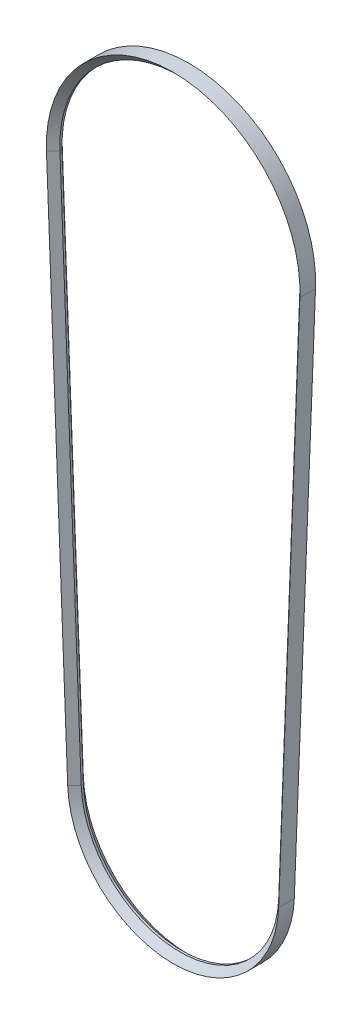
ISO-10303-21;
HEADER;
FILE_DESCRIPTION(('STEP AP214'),'2;1');
FILE_NAME('part.step','',(''),(''),'','','');
FILE_SCHEMA(('AUTOMOTIVE_DESIGN { 1 0 10303 214 1 1 1 1 }'));
ENDSEC;
DATA;
#1=APPLICATION_CONTEXT('core data for automotive mechanical design processes');
#2=APPLICATION_PROTOCOL_DEFINITION('international standard','automotive_design',2000,#1);
#3=PRODUCT_CONTEXT('',#1,'mechanical');
#4=PRODUCT('Part','Part','',(#3));
#5=PRODUCT_RELATED_PRODUCT_CATEGORY('part','',(#4));
#6=PRODUCT_DEFINITION_FORMATION('','',#4);
#7=PRODUCT_DEFINITION_CONTEXT('part definition',#1,'design');
#8=PRODUCT_DEFINITION('design','',#6,#7);
#9=PRODUCT_DEFINITION_SHAPE('','',#8);
#10=(LENGTH_UNIT() NAMED_UNIT(*) SI_UNIT(.MILLI.,.METRE.));
#11=(NAMED_UNIT(*) PLANE_ANGLE_UNIT() SI_UNIT($,.RADIAN.));
#12=(NAMED_UNIT(*) SI_UNIT($,.STERADIAN.) SOLID_ANGLE_UNIT());
#13=UNCERTAINTY_MEASURE_WITH_UNIT(LENGTH_MEASURE(1.E-05),#10,'distance_accuracy_value','');
#14=(GEOMETRIC_REPRESENTATION_CONTEXT(3) GLOBAL_UNCERTAINTY_ASSIGNED_CONTEXT((#13)) GLOBAL_UNIT_ASSIGNED_CONTEXT((#10,
#11,#12)) REPRESENTATION_CONTEXT('',''));
#15=CARTESIAN_POINT('',(0.,0.,0.));
#16=DIRECTION('',(0.,0.,1.));
#17=DIRECTION('',(1.,0.,0.));
#18=AXIS2_PLACEMENT_3D('',#15,#16,#17);
#19=CARTESIAN_POINT('',(2.78515976523799E-13,635.,9.20625000000001));
#20=DIRECTION('',(0.,0.,1.));
#21=DIRECTION('',(1.,0.,0.));
#22=AXIS2_PLACEMENT_3D('',#19,#20,#21);
#23=CONICAL_SURFACE('',#22,149.20625,0.785398163397449);
#24=DIRECTION('',(0.706558559816522,0.0278388496530093,-0.707106781186547));
#25=VECTOR('',#24,1.);
#26=CARTESIAN_POINT('',(-141.15922404193,629.438238188977,1.26875000000001));
#27=LINE('',#26,#25);
#28=CARTESIAN_POINT('',(-149.090570081538,629.125738188977,9.20625000000001));
#29=VERTEX_POINT('',#28);
#30=CARTESIAN_POINT('',(-141.15922404193,629.438238188977,1.26875000000001));
#31=VERTEX_POINT('',#30);
#32=EDGE_CURVE('E140',#29,#31,#27,.T.);
#33=ORIENTED_EDGE('',*,*,#32,.T.);
#34=CARTESIAN_POINT('',(2.78515976523799E-13,635.,1.26875000000001));
#35=DIRECTION('',(0.,0.,-1.));
#36=DIRECTION('',(-1.,0.,0.));
#37=AXIS2_PLACEMENT_3D('',#34,#35,#36);
#38=CIRCLE('',#37,141.26875);
#39=CARTESIAN_POINT('',(141.159224041931,629.438238188977,1.26875000000001));
#40=VERTEX_POINT('',#39);
#41=EDGE_CURVE('E45',#31,#40,#38,.T.);
#42=ORIENTED_EDGE('',*,*,#41,.T.);
#43=CARTESIAN_POINT('',(149.090570081539,629.125738188977,9.20624999999987));
#44=DIRECTION('',(-0.706558559816521,0.0278388496530284,-0.707106781186547));
#45=VECTOR('',#44,1.);
#46=LINE('',#43,#45);
#47=CARTESIAN_POINT('',(149.090570081538,629.125738188975,9.20625000000001));
#48=VERTEX_POINT('',#47);
#49=EDGE_CURVE('E104',#48,#40,#46,.T.);
#50=ORIENTED_EDGE('',*,*,#49,.F.);
#51=CARTESIAN_POINT('',(2.78515976523799E-13,635.,9.20625000000001));
#52=DIRECTION('',(0.,0.,-1.));
#53=DIRECTION('',(-1.,0.,0.));
#54=AXIS2_PLACEMENT_3D('',#51,#52,#53);
#55=CIRCLE('',#54,149.20625);
#56=EDGE_CURVE('E11',#29,#48,#55,.T.);
#57=ORIENTED_EDGE('',*,*,#56,.F.);
#58=EDGE_LOOP('',(#33,#42,#50,#57));
#59=FACE_BOUND('',#58,.T.);
#60=ADVANCED_FACE('F34',(#59),#23,.F.);
#61=CARTESIAN_POINT('',(2.78515976523799E-13,635.,0.));
#62=DIRECTION('',(0.,0.,-1.));
#63=DIRECTION('',(-1.,0.,0.));
#64=AXIS2_PLACEMENT_3D('',#61,#62,#63);
#65=CYLINDRICAL_SURFACE('',#64,141.26875);
#66=DIRECTION('',(0.,0.,-1.));
#67=VECTOR('',#66,1.);
#68=CARTESIAN_POINT('',(-141.15922404193,629.438238188977,1.26875000000001));
#69=LINE('',#68,#67);
#70=CARTESIAN_POINT('',(-141.15922404193,629.438238188977,-1.26875000000001));
#71=VERTEX_POINT('',#70);
#72=EDGE_CURVE('E390',#31,#71,#69,.T.);
#73=ORIENTED_EDGE('',*,*,#72,.T.);
#74=CARTESIAN_POINT('',(2.78515976523799E-13,635.,-1.26875000000001));
#75=DIRECTION('',(0.,0.,-1.));
#76=DIRECTION('',(-1.,0.,0.));
#77=AXIS2_PLACEMENT_3D('',#74,#75,#76);
#78=CIRCLE('',#77,141.26875);
#79=CARTESIAN_POINT('',(141.159224041931,629.438238188977,-1.26875000000001));
#80=VERTEX_POINT('',#79);
#81=EDGE_CURVE('E135',#71,#80,#78,.T.);
#82=ORIENTED_EDGE('',*,*,#81,.T.);
#83=CARTESIAN_POINT('',(141.159224041931,629.438238188977,1.26875000000001));
#84=DIRECTION('',(0.,0.,-1.));
#85=VECTOR('',#84,1.);
#86=LINE('',#83,#85);
#87=EDGE_CURVE('E116',#40,#80,#86,.T.);
#88=ORIENTED_EDGE('',*,*,#87,.F.);
#89=ORIENTED_EDGE('',*,*,#41,.F.);
#90=EDGE_LOOP('',(#73,#82,#88,#89));
#91=FACE_BOUND('',#90,.T.);
#92=ADVANCED_FACE('F133',(#91),#65,.F.);
#93=CARTESIAN_POINT('',(2.78515976523799E-13,635.,-1.26875000000001));
#94=DIRECTION('',(0.,0.,-1.));
#95=DIRECTION('',(-1.,0.,0.));
#96=AXIS2_PLACEMENT_3D('',#93,#94,#95);
#97=CONICAL_SURFACE('',#96,141.26875,0.785398163397449);
#98=DIRECTION('',(-0.706558559816522,-0.0278388496530093,-0.707106781186547));
#99=VECTOR('',#98,1.);
#100=CARTESIAN_POINT('',(-149.090570081538,629.125738188977,-9.20625));
#101=LINE('',#100,#99);
#102=CARTESIAN_POINT('',(-149.090570081538,629.125738188977,-9.20625));
#103=VERTEX_POINT('',#102);
#104=EDGE_CURVE('E387',#71,#103,#101,.T.);
#105=ORIENTED_EDGE('',*,*,#104,.T.);
#106=CARTESIAN_POINT('',(2.78515976523799E-13,635.,-9.20625));
#107=DIRECTION('',(0.,0.,-1.));
#108=DIRECTION('',(-1.,0.,0.));
#109=AXIS2_PLACEMENT_3D('',#106,#107,#108);
#110=CIRCLE('',#109,149.20625);
#111=CARTESIAN_POINT('',(149.090570081538,629.125738188975,-9.20625));
#112=VERTEX_POINT('',#111);
#113=EDGE_CURVE('E115',#103,#112,#110,.T.);
#114=ORIENTED_EDGE('',*,*,#113,.T.);
#115=CARTESIAN_POINT('',(141.159224041931,629.438238188977,-1.26875000000001));
#116=DIRECTION('',(0.706558559816522,-0.0278388496530185,-0.707106781186547));
#117=VECTOR('',#116,1.);
#118=LINE('',#115,#117);
#119=EDGE_CURVE('E136',#80,#112,#118,.T.);
#120=ORIENTED_EDGE('',*,*,#119,.F.);
#121=ORIENTED_EDGE('',*,*,#81,.F.);
#122=EDGE_LOOP('',(#105,#114,#120,#121));
#123=FACE_BOUND('',#122,.T.);
#124=ADVANCED_FACE('F174',(#123),#97,.F.);
#125=CARTESIAN_POINT('',(2.78515976523799E-13,635.,0.));
#126=DIRECTION('',(0.,0.,-1.));
#127=DIRECTION('',(-1.,0.,0.));
#128=AXIS2_PLACEMENT_3D('',#125,#126,#127);
#129=CYLINDRICAL_SURFACE('',#128,149.20625);
#130=DIRECTION('',(0.,0.,1.));
#131=VECTOR('',#130,1.);
#132=CARTESIAN_POINT('',(-149.090570081538,629.125738188977,9.20625000000001));
#133=LINE('',#132,#131);
#134=EDGE_CURVE('E384',#103,#29,#133,.T.);
#135=ORIENTED_EDGE('',*,*,#134,.T.);
#136=ORIENTED_EDGE('',*,*,#56,.T.);
#137=CARTESIAN_POINT('',(149.090570081539,629.125738188977,-9.20625));
#138=DIRECTION('',(0.,0.,1.));
#139=VECTOR('',#138,1.);
#140=LINE('',#137,#139);
#141=EDGE_CURVE('E53',#112,#48,#140,.T.);
#142=ORIENTED_EDGE('',*,*,#141,.F.);
#143=ORIENTED_EDGE('',*,*,#113,.F.);
#144=EDGE_LOOP('',(#135,#136,#142,#143));
#145=FACE_BOUND('',#144,.T.);
#146=ADVANCED_FACE('F163',(#145),#129,.T.);
#147=CARTESIAN_POINT('',(-116.178606594347,-4.57750984251966,1.26875000000001));
#148=DIRECTION('',(0.706558559816521,0.0278388496530131,0.707106781186548));
#149=DIRECTION('',(0.707380944980586,0.,-0.706832511050795));
#150=AXIS2_PLACEMENT_3D('',#147,#148,#149);
#151=PLANE('',#150);
#152=DIRECTION('',(0.706558559816522,0.0278388496530093,-0.707106781186547));
#153=VECTOR('',#152,1.);
#154=CARTESIAN_POINT('',(-116.178606594347,-4.57750984251966,1.26875000000001));
#155=LINE('',#154,#153);
#156=CARTESIAN_POINT('',(-124.109952633955,-4.89000984251961,9.20625000000001));
#157=VERTEX_POINT('',#156);
#158=CARTESIAN_POINT('',(-116.178606594347,-4.57750984251966,1.26875000000001));
#159=VERTEX_POINT('',#158);
#160=EDGE_CURVE('E370',#157,#159,#155,.T.);
#161=ORIENTED_EDGE('',*,*,#160,.T.);
#162=DIRECTION('',(-0.0393700787401567,0.999224697903326,0.));
#163=VECTOR('',#162,1.);
#164=CARTESIAN_POINT('',(-116.178606594347,-4.57750984251966,1.26875000000001));
#165=LINE('',#164,#163);
#166=EDGE_CURVE('E399',#159,#31,#165,.T.);
#167=ORIENTED_EDGE('',*,*,#166,.T.);
#168=ORIENTED_EDGE('',*,*,#32,.F.);
#169=DIRECTION('',(-0.0393700787401567,0.999224697903326,0.));
#170=VECTOR('',#169,1.);
#171=CARTESIAN_POINT('',(-124.109952633955,-4.89000984251961,9.20625000000001));
#172=LINE('',#171,#170);
#173=EDGE_CURVE('E401',#157,#29,#172,.T.);
#174=ORIENTED_EDGE('',*,*,#173,.F.);
#175=EDGE_LOOP('',(#161,#167,#168,#174));
#176=FACE_BOUND('',#175,.T.);
#177=ADVANCED_FACE('F173',(#176),#151,.T.);
#178=CARTESIAN_POINT('',(-116.178606594347,-4.57750984251966,1.26875000000001));
#179=DIRECTION('',(0.999224697903326,0.0393700787401567,0.));
#180=DIRECTION('',(-0.0393700787401567,0.999224697903326,0.));
#181=AXIS2_PLACEMENT_3D('',#178,#179,#180);
#182=PLANE('',#181);
#183=DIRECTION('',(0.,0.,-1.));
#184=VECTOR('',#183,1.);
#185=CARTESIAN_POINT('',(-116.178606594347,-4.57750984251966,1.26875000000001));
#186=LINE('',#185,#184);
#187=CARTESIAN_POINT('',(-116.178606594347,-4.57750984251966,-1.26875000000001));
#188=VERTEX_POINT('',#187);
#189=EDGE_CURVE('E368',#159,#188,#186,.T.);
#190=ORIENTED_EDGE('',*,*,#189,.T.);
#191=DIRECTION('',(-0.0393700787401567,0.999224697903326,0.));
#192=VECTOR('',#191,1.);
#193=CARTESIAN_POINT('',(-116.178606594347,-4.57750984251966,-1.26875000000001));
#194=LINE('',#193,#192);
#195=EDGE_CURVE('E396',#188,#71,#194,.T.);
#196=ORIENTED_EDGE('',*,*,#195,.T.);
#197=ORIENTED_EDGE('',*,*,#72,.F.);
#198=ORIENTED_EDGE('',*,*,#166,.F.);
#199=EDGE_LOOP('',(#190,#196,#197,#198));
#200=FACE_BOUND('',#199,.T.);
#201=ADVANCED_FACE('F235',(#200),#182,.T.);
#202=CARTESIAN_POINT('',(-124.109952633955,-4.89000984251961,-9.20625));
#203=DIRECTION('',(0.706558559816521,0.0278388496530131,-0.707106781186548));
#204=DIRECTION('',(-0.707380944980586,0.,-0.706832511050795));
#205=AXIS2_PLACEMENT_3D('',#202,#203,#204);
#206=PLANE('',#205);
#207=DIRECTION('',(-0.706558559816522,-0.0278388496530093,-0.707106781186547));
#208=VECTOR('',#207,1.);
#209=CARTESIAN_POINT('',(-124.109952633955,-4.89000984251961,-9.20625));
#210=LINE('',#209,#208);
#211=CARTESIAN_POINT('',(-124.109952633955,-4.89000984251961,-9.20625));
#212=VERTEX_POINT('',#211);
#213=EDGE_CURVE('E365',#188,#212,#210,.T.);
#214=ORIENTED_EDGE('',*,*,#213,.T.);
#215=DIRECTION('',(-0.0393700787401567,0.999224697903326,0.));
#216=VECTOR('',#215,1.);
#217=CARTESIAN_POINT('',(-124.109952633955,-4.89000984251961,-9.20625));
#218=LINE('',#217,#216);
#219=EDGE_CURVE('E393',#212,#103,#218,.T.);
#220=ORIENTED_EDGE('',*,*,#219,.T.);
#221=ORIENTED_EDGE('',*,*,#104,.F.);
#222=ORIENTED_EDGE('',*,*,#195,.F.);
#223=EDGE_LOOP('',(#214,#220,#221,#222));
#224=FACE_BOUND('',#223,.T.);
#225=ADVANCED_FACE('F232',(#224),#206,.T.);
#226=CARTESIAN_POINT('',(-124.109952633955,-4.89000984251961,9.20625000000001));
#227=DIRECTION('',(-0.999224697903326,-0.0393700787401567,0.));
#228=DIRECTION('',(0.0393700787401567,-0.999224697903326,0.));
#229=AXIS2_PLACEMENT_3D('',#226,#227,#228);
#230=PLANE('',#229);
#231=DIRECTION('',(0.,0.,1.));
#232=VECTOR('',#231,1.);
#233=CARTESIAN_POINT('',(-124.109952633955,-4.89000984251961,9.20625000000001));
#234=LINE('',#233,#232);
#235=EDGE_CURVE('E193',#212,#157,#234,.T.);
#236=ORIENTED_EDGE('',*,*,#235,.T.);
#237=ORIENTED_EDGE('',*,*,#173,.T.);
#238=ORIENTED_EDGE('',*,*,#134,.F.);
#239=ORIENTED_EDGE('',*,*,#219,.F.);
#240=EDGE_LOOP('',(#236,#237,#238,#239));
#241=FACE_BOUND('',#240,.T.);
#242=ADVANCED_FACE('F228',(#241),#230,.T.);
#243=CARTESIAN_POINT('',(0.,0.,9.20625000000001));
#244=DIRECTION('',(0.,0.,1.));
#245=DIRECTION('',(1.,0.,0.));
#246=AXIS2_PLACEMENT_3D('',#243,#244,#245);
#247=CONICAL_SURFACE('',#246,124.20625,0.785398163397448);
#248=DIRECTION('',(-0.706558559816521,0.027838849653018,-0.707106781186547));
#249=VECTOR('',#248,1.);
#250=CARTESIAN_POINT('',(116.178606594347,-4.5775098425197,1.26875000000001));
#251=LINE('',#250,#249);
#252=CARTESIAN_POINT('',(124.109952633955,-4.89000984251975,9.20625000000001));
#253=VERTEX_POINT('',#252);
#254=CARTESIAN_POINT('',(116.178606594347,-4.5775098425197,1.26875000000001));
#255=VERTEX_POINT('',#254);
#256=EDGE_CURVE('E359',#253,#255,#251,.T.);
#257=ORIENTED_EDGE('',*,*,#256,.T.);
#258=CARTESIAN_POINT('',(0.,0.,1.26875000000001));
#259=DIRECTION('',(0.,0.,-1.));
#260=DIRECTION('',(-1.,0.,0.));
#261=AXIS2_PLACEMENT_3D('',#258,#259,#260);
#262=CIRCLE('',#261,116.26875);
#263=EDGE_CURVE('E378',#255,#159,#262,.T.);
#264=ORIENTED_EDGE('',*,*,#263,.T.);
#265=ORIENTED_EDGE('',*,*,#160,.F.);
#266=CARTESIAN_POINT('',(0.,0.,9.20625000000001));
#267=DIRECTION('',(0.,0.,-1.));
#268=DIRECTION('',(-1.,0.,0.));
#269=AXIS2_PLACEMENT_3D('',#266,#267,#268);
#270=CIRCLE('',#269,124.20625);
#271=EDGE_CURVE('E381',#253,#157,#270,.T.);
#272=ORIENTED_EDGE('',*,*,#271,.F.);
#273=EDGE_LOOP('',(#257,#264,#265,#272));
#274=FACE_BOUND('',#273,.T.);
#275=ADVANCED_FACE('F224',(#274),#247,.F.);
#276=CARTESIAN_POINT('',(0.,0.,0.));
#277=DIRECTION('',(0.,0.,-1.));
#278=DIRECTION('',(-1.,0.,0.));
#279=AXIS2_PLACEMENT_3D('',#276,#277,#278);
#280=CYLINDRICAL_SURFACE('',#279,116.26875);
#281=DIRECTION('',(0.,0.,-1.));
#282=VECTOR('',#281,1.);
#283=CARTESIAN_POINT('',(116.178606594347,-4.5775098425197,1.26875000000001));
#284=LINE('',#283,#282);
#285=CARTESIAN_POINT('',(116.178606594347,-4.5775098425197,-1.26875000000001));
#286=VERTEX_POINT('',#285);
#287=EDGE_CURVE('E126',#255,#286,#284,.T.);
#288=ORIENTED_EDGE('',*,*,#287,.T.);
#289=CARTESIAN_POINT('',(0.,0.,-1.26875000000001));
#290=DIRECTION('',(0.,0.,-1.));
#291=DIRECTION('',(-1.,0.,0.));
#292=AXIS2_PLACEMENT_3D('',#289,#290,#291);
#293=CIRCLE('',#292,116.26875);
#294=EDGE_CURVE('E375',#286,#188,#293,.T.);
#295=ORIENTED_EDGE('',*,*,#294,.T.);
#296=ORIENTED_EDGE('',*,*,#189,.F.);
#297=ORIENTED_EDGE('',*,*,#263,.F.);
#298=EDGE_LOOP('',(#288,#295,#296,#297));
#299=FACE_BOUND('',#298,.T.);
#300=ADVANCED_FACE('F220',(#299),#280,.F.);
#301=CARTESIAN_POINT('',(0.,0.,-1.26875000000001));
#302=DIRECTION('',(0.,0.,-1.));
#303=DIRECTION('',(-1.,0.,0.));
#304=AXIS2_PLACEMENT_3D('',#301,#302,#303);
#305=CONICAL_SURFACE('',#304,116.26875,0.785398163397449);
#306=DIRECTION('',(0.706558559816522,-0.027838849653018,-0.707106781186547));
#307=VECTOR('',#306,1.);
#308=CARTESIAN_POINT('',(124.109952633955,-4.89000984251975,-9.20625));
#309=LINE('',#308,#307);
#310=CARTESIAN_POINT('',(124.109952633955,-4.89000984251975,-9.20625));
#311=VERTEX_POINT('',#310);
#312=EDGE_CURVE('E355',#286,#311,#309,.T.);
#313=ORIENTED_EDGE('',*,*,#312,.T.);
#314=CARTESIAN_POINT('',(0.,0.,-9.20625));
#315=DIRECTION('',(0.,0.,-1.));
#316=DIRECTION('',(-1.,0.,0.));
#317=AXIS2_PLACEMENT_3D('',#314,#315,#316);
#318=CIRCLE('',#317,124.20625);
#319=EDGE_CURVE('E373',#311,#212,#318,.T.);
#320=ORIENTED_EDGE('',*,*,#319,.T.);
#321=ORIENTED_EDGE('',*,*,#213,.F.);
#322=ORIENTED_EDGE('',*,*,#294,.F.);
#323=EDGE_LOOP('',(#313,#320,#321,#322));
#324=FACE_BOUND('',#323,.T.);
#325=ADVANCED_FACE('F216',(#324),#305,.F.);
#326=CARTESIAN_POINT('',(0.,0.,0.));
#327=DIRECTION('',(0.,0.,-1.));
#328=DIRECTION('',(-1.,0.,0.));
#329=AXIS2_PLACEMENT_3D('',#326,#327,#328);
#330=CYLINDRICAL_SURFACE('',#329,124.20625);
#331=DIRECTION('',(0.,0.,1.));
#332=VECTOR('',#331,1.);
#333=CARTESIAN_POINT('',(124.109952633955,-4.89000984251975,9.20625000000001));
#334=LINE('',#333,#332);
#335=EDGE_CURVE('E354',#311,#253,#334,.T.);
#336=ORIENTED_EDGE('',*,*,#335,.T.);
#337=ORIENTED_EDGE('',*,*,#271,.T.);
#338=ORIENTED_EDGE('',*,*,#235,.F.);
#339=ORIENTED_EDGE('',*,*,#319,.F.);
#340=EDGE_LOOP('',(#336,#337,#338,#339));
#341=FACE_BOUND('',#340,.T.);
#342=ADVANCED_FACE('F211',(#341),#330,.T.);
#343=CARTESIAN_POINT('',(124.109952633955,-4.89000984251975,9.20625000000001));
#344=DIRECTION('',(-0.999224697903326,0.0393700787401581,0.));
#345=DIRECTION('',(-0.0393700787401581,-0.999224697903326,0.));
#346=AXIS2_PLACEMENT_3D('',#343,#344,#345);
#347=PLANE('',#346);
#348=ORIENTED_EDGE('',*,*,#141,.T.);
#349=DIRECTION('',(0.0393700787401581,0.999224697903326,0.));
#350=VECTOR('',#349,1.);
#351=CARTESIAN_POINT('',(124.109952633955,-4.89000984251975,9.20625000000001));
#352=LINE('',#351,#350);
#353=EDGE_CURVE('E111',#253,#48,#352,.T.);
#354=ORIENTED_EDGE('',*,*,#353,.F.);
#355=ORIENTED_EDGE('',*,*,#335,.F.);
#356=DIRECTION('',(0.0393700787401581,0.999224697903326,0.));
#357=VECTOR('',#356,1.);
#358=CARTESIAN_POINT('',(124.109952633955,-4.89000984251975,-9.20625));
#359=LINE('',#358,#357);
#360=EDGE_CURVE('E200',#311,#112,#359,.T.);
#361=ORIENTED_EDGE('',*,*,#360,.T.);
#362=EDGE_LOOP('',(#348,#354,#355,#361));
#363=FACE_BOUND('',#362,.T.);
#364=ADVANCED_FACE('F201',(#363),#347,.F.);
#365=CARTESIAN_POINT('',(116.178606594347,-4.5775098425197,1.26875000000001));
#366=DIRECTION('',(0.706558559816521,-0.0278388496530141,-0.707106781186548));
#367=DIRECTION('',(-0.707380944980586,0.,-0.706832511050795));
#368=AXIS2_PLACEMENT_3D('',#365,#366,#367);
#369=PLANE('',#368);
#370=ORIENTED_EDGE('',*,*,#49,.T.);
#371=DIRECTION('',(0.0393700787401581,0.999224697903326,0.));
#372=VECTOR('',#371,1.);
#373=CARTESIAN_POINT('',(116.178606594347,-4.5775098425197,1.26875000000001));
#374=LINE('',#373,#372);
#375=EDGE_CURVE('E109',#255,#40,#374,.T.);
#376=ORIENTED_EDGE('',*,*,#375,.F.);
#377=ORIENTED_EDGE('',*,*,#256,.F.);
#378=ORIENTED_EDGE('',*,*,#353,.T.);
#379=EDGE_LOOP('',(#370,#376,#377,#378));
#380=FACE_BOUND('',#379,.T.);
#381=ADVANCED_FACE('F107',(#380),#369,.F.);
#382=CARTESIAN_POINT('',(116.178606594347,-4.5775098425197,1.26875000000001));
#383=DIRECTION('',(0.999224697903326,-0.0393700787401581,0.));
#384=DIRECTION('',(0.0393700787401581,0.999224697903326,0.));
#385=AXIS2_PLACEMENT_3D('',#382,#383,#384);
#386=PLANE('',#385);
#387=ORIENTED_EDGE('',*,*,#87,.T.);
#388=DIRECTION('',(0.0393700787401581,0.999224697903326,0.));
#389=VECTOR('',#388,1.);
#390=CARTESIAN_POINT('',(116.178606594347,-4.5775098425197,-1.26875000000001));
#391=LINE('',#390,#389);
#392=EDGE_CURVE('E127',#286,#80,#391,.T.);
#393=ORIENTED_EDGE('',*,*,#392,.F.);
#394=ORIENTED_EDGE('',*,*,#287,.F.);
#395=ORIENTED_EDGE('',*,*,#375,.T.);
#396=EDGE_LOOP('',(#387,#393,#394,#395));
#397=FACE_BOUND('',#396,.T.);
#398=ADVANCED_FACE('F121',(#397),#386,.F.);
#399=CARTESIAN_POINT('',(124.109952633955,-4.89000984251975,-9.20625));
#400=DIRECTION('',(0.706558559816521,-0.0278388496530141,0.707106781186548));
#401=DIRECTION('',(0.707380944980586,0.,-0.706832511050795));
#402=AXIS2_PLACEMENT_3D('',#399,#400,#401);
#403=PLANE('',#402);
#404=ORIENTED_EDGE('',*,*,#119,.T.);
#405=ORIENTED_EDGE('',*,*,#360,.F.);
#406=ORIENTED_EDGE('',*,*,#312,.F.);
#407=ORIENTED_EDGE('',*,*,#392,.T.);
#408=EDGE_LOOP('',(#404,#405,#406,#407));
#409=FACE_BOUND('',#408,.T.);
#410=ADVANCED_FACE('F324',(#409),#403,.F.);
#411=CLOSED_SHELL('',(#60,#92,#124,#146,#177,#201,#225,#242,#275,#300,#325,#342,#364,#381,#398,#410));
#412=MANIFOLD_SOLID_BREP('B2',#411);
#413=ADVANCED_BREP_SHAPE_REPRESENTATION('',(#18,#412),#14);
#414=SHAPE_DEFINITION_REPRESENTATION(#9,#413);
ENDSEC;
END-ISO-10303-21;
